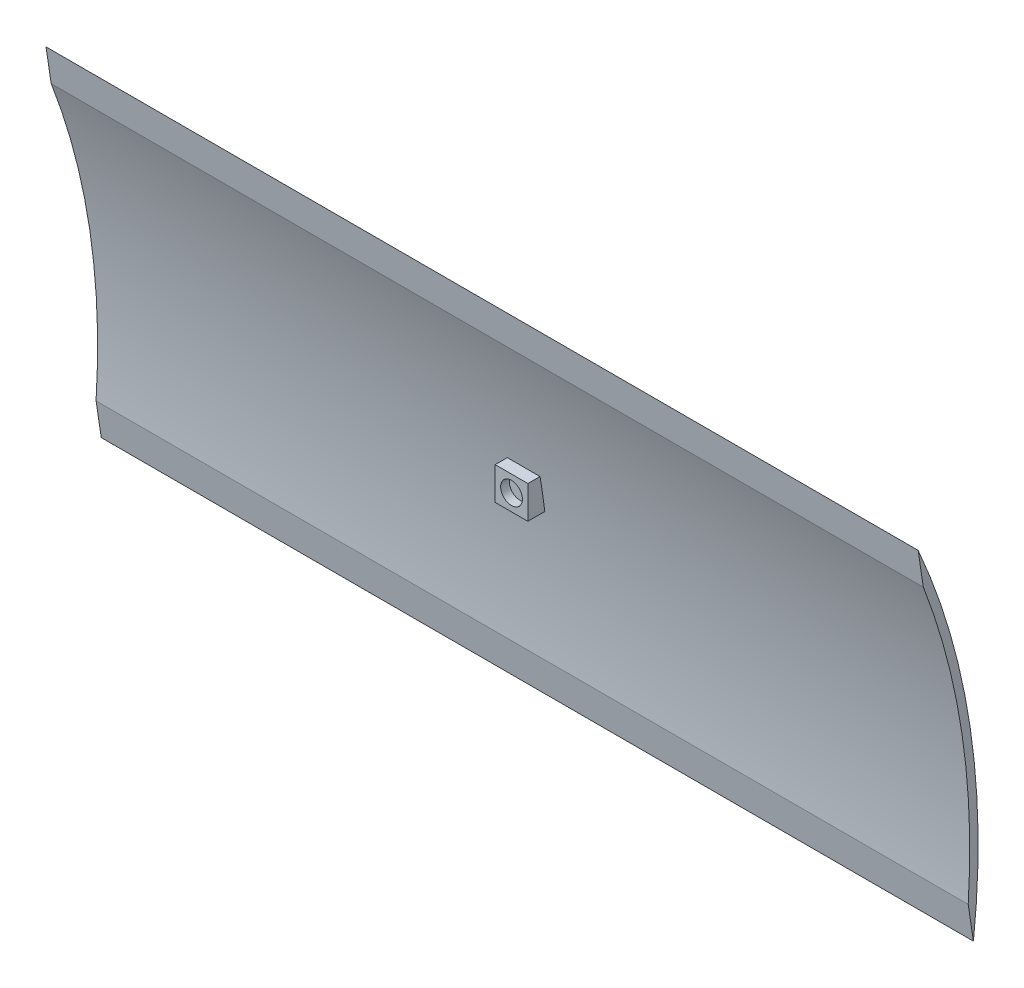
ISO-10303-21;
HEADER;
FILE_DESCRIPTION(('STEP AP214'),'2;1');
FILE_NAME('part.step','',(''),(''),'','','');
FILE_SCHEMA(('AUTOMOTIVE_DESIGN { 1 0 10303 214 1 1 1 1 }'));
ENDSEC;
DATA;
#1=APPLICATION_CONTEXT('core data for automotive mechanical design processes');
#2=APPLICATION_PROTOCOL_DEFINITION('international standard','automotive_design',2000,#1);
#3=PRODUCT_CONTEXT('',#1,'mechanical');
#4=PRODUCT('Part','Part','',(#3));
#5=PRODUCT_RELATED_PRODUCT_CATEGORY('part','',(#4));
#6=PRODUCT_DEFINITION_FORMATION('','',#4);
#7=PRODUCT_DEFINITION_CONTEXT('part definition',#1,'design');
#8=PRODUCT_DEFINITION('design','',#6,#7);
#9=PRODUCT_DEFINITION_SHAPE('','',#8);
#10=(LENGTH_UNIT() NAMED_UNIT(*) SI_UNIT(.MILLI.,.METRE.));
#11=(NAMED_UNIT(*) PLANE_ANGLE_UNIT() SI_UNIT($,.RADIAN.));
#12=(NAMED_UNIT(*) SI_UNIT($,.STERADIAN.) SOLID_ANGLE_UNIT());
#13=UNCERTAINTY_MEASURE_WITH_UNIT(LENGTH_MEASURE(1.E-05),#10,'distance_accuracy_value','');
#14=(GEOMETRIC_REPRESENTATION_CONTEXT(3) GLOBAL_UNCERTAINTY_ASSIGNED_CONTEXT((#13)) GLOBAL_UNIT_ASSIGNED_CONTEXT((#10,
#11,#12)) REPRESENTATION_CONTEXT('',''));
#15=CARTESIAN_POINT('',(0.,0.,0.));
#16=DIRECTION('',(0.,0.,1.));
#17=DIRECTION('',(1.,0.,0.));
#18=AXIS2_PLACEMENT_3D('',#15,#16,#17);
#19=CARTESIAN_POINT('',(-50.,0.,0.));
#20=DIRECTION('',(1.,0.,0.));
#21=DIRECTION('',(0.,0.,-1.));
#22=AXIS2_PLACEMENT_3D('',#19,#20,#21);
#23=CYLINDRICAL_SURFACE('',#22,160.09);
#24=CARTESIAN_POINT('',(53.75,0.,0.));
#25=DIRECTION('',(1.,0.,0.));
#26=DIRECTION('',(0.,0.,-1.));
#27=AXIS2_PLACEMENT_3D('',#24,#25,#26);
#28=CIRCLE('',#27,160.09);
#29=CARTESIAN_POINT('',(53.75,27.0890830134152,-157.781461780186));
#30=VERTEX_POINT('',#29);
#31=CARTESIAN_POINT('',(53.75,19.5890830134153,-158.886991055572));
#32=VERTEX_POINT('',#31);
#33=EDGE_CURVE('E98',#30,#32,#28,.F.);
#34=ORIENTED_EDGE('',*,*,#33,.T.);
#35=DIRECTION('',(1.,0.,0.));
#36=VECTOR('',#35,1.);
#37=CARTESIAN_POINT('',(-50.,19.5890830134152,-158.886991055572));
#38=LINE('',#37,#36);
#39=CARTESIAN_POINT('',(46.25,19.5890830134152,-158.886991055572));
#40=VERTEX_POINT('',#39);
#41=EDGE_CURVE('E101',#32,#40,#38,.F.);
#42=ORIENTED_EDGE('',*,*,#41,.T.);
#43=CARTESIAN_POINT('',(46.25,0.,0.));
#44=DIRECTION('',(-1.,0.,0.));
#45=DIRECTION('',(0.,0.,1.));
#46=AXIS2_PLACEMENT_3D('',#43,#44,#45);
#47=CIRCLE('',#46,160.09);
#48=CARTESIAN_POINT('',(46.25,27.0890830134152,-157.781461780186));
#49=VERTEX_POINT('',#48);
#50=EDGE_CURVE('E59',#40,#49,#47,.F.);
#51=ORIENTED_EDGE('',*,*,#50,.T.);
#52=DIRECTION('',(1.,0.,0.));
#53=VECTOR('',#52,1.);
#54=CARTESIAN_POINT('',(-50.,27.0890830134152,-157.781461780186));
#55=LINE('',#54,#53);
#56=EDGE_CURVE('E54',#49,#30,#55,.T.);
#57=ORIENTED_EDGE('',*,*,#56,.T.);
#58=EDGE_LOOP('',(#34,#42,#51,#57));
#59=FACE_BOUND('',#58,.T.);
#60=DIRECTION('',(1.,0.,0.));
#61=VECTOR('',#60,1.);
#62=CARTESIAN_POINT('',(-50.,-10.7314070648173,-159.72991267264));
#63=LINE('',#62,#61);
#64=CARTESIAN_POINT('',(-50.,-10.7314070648173,-159.72991267264));
#65=VERTEX_POINT('',#64);
#66=CARTESIAN_POINT('',(150.,-10.7314070648173,-159.72991267264));
#67=VERTEX_POINT('',#66);
#68=EDGE_CURVE('E41',#65,#67,#63,.T.);
#69=ORIENTED_EDGE('',*,*,#68,.T.);
#70=CARTESIAN_POINT('',(150.,0.,0.));
#71=DIRECTION('',(-1.,0.,0.));
#72=DIRECTION('',(0.,0.,-1.));
#73=AXIS2_PLACEMENT_3D('',#70,#71,#72);
#74=CIRCLE('',#73,160.09);
#75=CARTESIAN_POINT('',(150.,57.4095730916477,-149.442125980042));
#76=VERTEX_POINT('',#75);
#77=EDGE_CURVE('E131',#76,#67,#74,.T.);
#78=ORIENTED_EDGE('',*,*,#77,.F.);
#79=DIRECTION('',(1.,0.,0.));
#80=VECTOR('',#79,1.);
#81=CARTESIAN_POINT('',(-50.,57.4095730916477,-149.442125980042));
#82=LINE('',#81,#80);
#83=CARTESIAN_POINT('',(-50.,57.4095730916477,-149.442125980042));
#84=VERTEX_POINT('',#83);
#85=EDGE_CURVE('E11',#84,#76,#82,.T.);
#86=ORIENTED_EDGE('',*,*,#85,.F.);
#87=CARTESIAN_POINT('',(-50.,0.,0.));
#88=DIRECTION('',(-1.,0.,0.));
#89=DIRECTION('',(0.,0.,-1.));
#90=AXIS2_PLACEMENT_3D('',#87,#88,#89);
#91=CIRCLE('',#90,160.09);
#92=EDGE_CURVE('E143',#84,#65,#91,.T.);
#93=ORIENTED_EDGE('',*,*,#92,.T.);
#94=EDGE_LOOP('',(#69,#78,#86,#93));
#95=FACE_BOUND('',#94,.T.);
#96=ADVANCED_FACE('F38',(#59,#95),#23,.F.);
#97=CARTESIAN_POINT('',(-50.,65.3185996356515,-148.248037226931));
#98=DIRECTION('',(0.,-0.14928611469432,0.988794041223689));
#99=DIRECTION('',(0.,-0.988794041223689,-0.14928611469432));
#100=AXIS2_PLACEMENT_3D('',#97,#98,#99);
#101=PLANE('',#100);
#102=ORIENTED_EDGE('',*,*,#85,.T.);
#103=DIRECTION('',(0.,-0.988794041223689,-0.14928611469432));
#104=VECTOR('',#103,1.);
#105=CARTESIAN_POINT('',(150.,65.3185996356515,-148.248037226931));
#106=LINE('',#105,#104);
#107=CARTESIAN_POINT('',(150.,65.3185996356515,-148.248037226931));
#108=VERTEX_POINT('',#107);
#109=EDGE_CURVE('E140',#108,#76,#106,.T.);
#110=ORIENTED_EDGE('',*,*,#109,.F.);
#111=DIRECTION('',(1.,0.,0.));
#112=VECTOR('',#111,1.);
#113=CARTESIAN_POINT('',(-50.,65.3185996356515,-148.248037226931));
#114=LINE('',#113,#112);
#115=CARTESIAN_POINT('',(-50.,65.3185996356515,-148.248037226931));
#116=VERTEX_POINT('',#115);
#117=EDGE_CURVE('E46',#116,#108,#114,.T.);
#118=ORIENTED_EDGE('',*,*,#117,.F.);
#119=DIRECTION('',(0.,-0.988794041223689,-0.14928611469432));
#120=VECTOR('',#119,1.);
#121=CARTESIAN_POINT('',(-50.,65.3185996356515,-148.248037226931));
#122=LINE('',#121,#120);
#123=EDGE_CURVE('E152',#116,#84,#122,.T.);
#124=ORIENTED_EDGE('',*,*,#123,.T.);
#125=EDGE_LOOP('',(#102,#110,#118,#124));
#126=FACE_BOUND('',#125,.T.);
#127=ADVANCED_FACE('F167',(#126),#101,.T.);
#128=CARTESIAN_POINT('',(-50.,0.,0.));
#129=DIRECTION('',(1.,0.,0.));
#130=DIRECTION('',(0.,0.,-1.));
#131=AXIS2_PLACEMENT_3D('',#128,#129,#130);
#132=CYLINDRICAL_SURFACE('',#131,162.);
#133=ORIENTED_EDGE('',*,*,#117,.T.);
#134=CARTESIAN_POINT('',(150.,0.,0.));
#135=DIRECTION('',(1.,0.,0.));
#136=DIRECTION('',(0.,0.,-1.));
#137=AXIS2_PLACEMENT_3D('',#134,#135,#136);
#138=CIRCLE('',#137,162.);
#139=CARTESIAN_POINT('',(150.,-18.6404336088211,-160.924001425751));
#140=VERTEX_POINT('',#139);
#141=EDGE_CURVE('E137',#140,#108,#138,.T.);
#142=ORIENTED_EDGE('',*,*,#141,.F.);
#143=DIRECTION('',(1.,0.,0.));
#144=VECTOR('',#143,1.);
#145=CARTESIAN_POINT('',(-50.,-18.6404336088211,-160.924001425751));
#146=LINE('',#145,#144);
#147=CARTESIAN_POINT('',(-50.,-18.6404336088211,-160.924001425751));
#148=VERTEX_POINT('',#147);
#149=EDGE_CURVE('E155',#148,#140,#146,.T.);
#150=ORIENTED_EDGE('',*,*,#149,.F.);
#151=CARTESIAN_POINT('',(-50.,0.,0.));
#152=DIRECTION('',(1.,0.,0.));
#153=DIRECTION('',(0.,0.,-1.));
#154=AXIS2_PLACEMENT_3D('',#151,#152,#153);
#155=CIRCLE('',#154,162.);
#156=EDGE_CURVE('E149',#148,#116,#155,.T.);
#157=ORIENTED_EDGE('',*,*,#156,.T.);
#158=EDGE_LOOP('',(#133,#142,#150,#157));
#159=FACE_BOUND('',#158,.T.);
#160=ADVANCED_FACE('F173',(#159),#132,.T.);
#161=CARTESIAN_POINT('',(-50.,-10.7314070648173,-159.72991267264));
#162=DIRECTION('',(0.,-0.149286114694316,0.98879404122369));
#163=DIRECTION('',(0.,-0.98879404122369,-0.149286114694316));
#164=AXIS2_PLACEMENT_3D('',#161,#162,#163);
#165=PLANE('',#164);
#166=ORIENTED_EDGE('',*,*,#149,.T.);
#167=DIRECTION('',(0.,-0.98879404122369,-0.149286114694316));
#168=VECTOR('',#167,1.);
#169=CARTESIAN_POINT('',(150.,-10.7314070648173,-159.72991267264));
#170=LINE('',#169,#168);
#171=EDGE_CURVE('E134',#67,#140,#170,.T.);
#172=ORIENTED_EDGE('',*,*,#171,.F.);
#173=ORIENTED_EDGE('',*,*,#68,.F.);
#174=DIRECTION('',(0.,-0.98879404122369,-0.149286114694316));
#175=VECTOR('',#174,1.);
#176=CARTESIAN_POINT('',(-50.,-10.7314070648173,-159.72991267264));
#177=LINE('',#176,#175);
#178=EDGE_CURVE('E146',#65,#148,#177,.T.);
#179=ORIENTED_EDGE('',*,*,#178,.T.);
#180=EDGE_LOOP('',(#166,#172,#173,#179));
#181=FACE_BOUND('',#180,.T.);
#182=ADVANCED_FACE('F161',(#181),#165,.T.);
#183=CARTESIAN_POINT('',(-50.,0.,0.));
#184=DIRECTION('',(1.,0.,0.));
#185=DIRECTION('',(0.,0.,-1.));
#186=AXIS2_PLACEMENT_3D('',#183,#184,#185);
#187=PLANE('',#186);
#188=ORIENTED_EDGE('',*,*,#92,.F.);
#189=ORIENTED_EDGE('',*,*,#123,.F.);
#190=ORIENTED_EDGE('',*,*,#156,.F.);
#191=ORIENTED_EDGE('',*,*,#178,.F.);
#192=EDGE_LOOP('',(#188,#189,#190,#191));
#193=FACE_BOUND('',#192,.T.);
#194=ADVANCED_FACE('F170',(#193),#187,.F.);
#195=CARTESIAN_POINT('',(150.,0.,0.));
#196=DIRECTION('',(1.,0.,0.));
#197=DIRECTION('',(0.,0.,-1.));
#198=AXIS2_PLACEMENT_3D('',#195,#196,#197);
#199=PLANE('',#198);
#200=ORIENTED_EDGE('',*,*,#77,.T.);
#201=ORIENTED_EDGE('',*,*,#171,.T.);
#202=ORIENTED_EDGE('',*,*,#141,.T.);
#203=ORIENTED_EDGE('',*,*,#109,.T.);
#204=EDGE_LOOP('',(#200,#201,#202,#203));
#205=FACE_BOUND('',#204,.T.);
#206=ADVANCED_FACE('F164',(#205),#199,.T.);
#207=CARTESIAN_POINT('',(53.75,27.0890830134153,-162.002));
#208=DIRECTION('',(1.,0.,0.));
#209=DIRECTION('',(0.,0.,-1.));
#210=AXIS2_PLACEMENT_3D('',#207,#208,#209);
#211=PLANE('',#210);
#212=ORIENTED_EDGE('',*,*,#33,.F.);
#213=DIRECTION('',(0.,0.,1.));
#214=VECTOR('',#213,1.);
#215=CARTESIAN_POINT('',(53.75,27.0890830134153,-162.002));
#216=LINE('',#215,#214);
#217=CARTESIAN_POINT('',(53.75,27.0890830134153,-155.));
#218=VERTEX_POINT('',#217);
#219=EDGE_CURVE('E105',#30,#218,#216,.T.);
#220=ORIENTED_EDGE('',*,*,#219,.T.);
#221=DIRECTION('',(0.,1.,0.));
#222=VECTOR('',#221,1.);
#223=CARTESIAN_POINT('',(53.75,27.0890830134153,-155.));
#224=LINE('',#223,#222);
#225=CARTESIAN_POINT('',(53.75,19.5890830134153,-155.));
#226=VERTEX_POINT('',#225);
#227=EDGE_CURVE('E119',#226,#218,#224,.T.);
#228=ORIENTED_EDGE('',*,*,#227,.F.);
#229=DIRECTION('',(0.,0.,1.));
#230=VECTOR('',#229,1.);
#231=CARTESIAN_POINT('',(53.75,19.5890830134153,-162.002));
#232=LINE('',#231,#230);
#233=EDGE_CURVE('E111',#32,#226,#232,.T.);
#234=ORIENTED_EDGE('',*,*,#233,.F.);
#235=EDGE_LOOP('',(#212,#220,#228,#234));
#236=FACE_BOUND('',#235,.T.);
#237=ADVANCED_FACE('F117',(#236),#211,.T.);
#238=CARTESIAN_POINT('',(46.25,27.0890830134153,-162.002));
#239=DIRECTION('',(0.,1.,0.));
#240=DIRECTION('',(0.,0.,1.));
#241=AXIS2_PLACEMENT_3D('',#238,#239,#240);
#242=PLANE('',#241);
#243=ORIENTED_EDGE('',*,*,#56,.F.);
#244=DIRECTION('',(0.,0.,1.));
#245=VECTOR('',#244,1.);
#246=CARTESIAN_POINT('',(46.25,27.0890830134153,-162.002));
#247=LINE('',#246,#245);
#248=CARTESIAN_POINT('',(46.25,27.0890830134153,-155.));
#249=VERTEX_POINT('',#248);
#250=EDGE_CURVE('E125',#49,#249,#247,.T.);
#251=ORIENTED_EDGE('',*,*,#250,.T.);
#252=DIRECTION('',(-1.,0.,0.));
#253=VECTOR('',#252,1.);
#254=CARTESIAN_POINT('',(46.25,27.0890830134153,-155.));
#255=LINE('',#254,#253);
#256=EDGE_CURVE('E120',#218,#249,#255,.T.);
#257=ORIENTED_EDGE('',*,*,#256,.F.);
#258=ORIENTED_EDGE('',*,*,#219,.F.);
#259=EDGE_LOOP('',(#243,#251,#257,#258));
#260=FACE_BOUND('',#259,.T.);
#261=ADVANCED_FACE('F224',(#260),#242,.T.);
#262=CARTESIAN_POINT('',(46.25,27.0890830134153,-162.002));
#263=DIRECTION('',(-1.,0.,0.));
#264=DIRECTION('',(0.,0.,1.));
#265=AXIS2_PLACEMENT_3D('',#262,#263,#264);
#266=PLANE('',#265);
#267=ORIENTED_EDGE('',*,*,#50,.F.);
#268=DIRECTION('',(0.,0.,1.));
#269=VECTOR('',#268,1.);
#270=CARTESIAN_POINT('',(46.25,19.5890830134153,-162.002));
#271=LINE('',#270,#269);
#272=CARTESIAN_POINT('',(46.25,19.5890830134153,-155.));
#273=VERTEX_POINT('',#272);
#274=EDGE_CURVE('E113',#40,#273,#271,.T.);
#275=ORIENTED_EDGE('',*,*,#274,.T.);
#276=DIRECTION('',(0.,-1.,0.));
#277=VECTOR('',#276,1.);
#278=CARTESIAN_POINT('',(46.25,27.0890830134153,-155.));
#279=LINE('',#278,#277);
#280=EDGE_CURVE('E123',#249,#273,#279,.T.);
#281=ORIENTED_EDGE('',*,*,#280,.F.);
#282=ORIENTED_EDGE('',*,*,#250,.F.);
#283=EDGE_LOOP('',(#267,#275,#281,#282));
#284=FACE_BOUND('',#283,.T.);
#285=ADVANCED_FACE('F231',(#284),#266,.T.);
#286=CARTESIAN_POINT('',(46.25,19.5890830134153,-162.002));
#287=DIRECTION('',(0.,-1.,0.));
#288=DIRECTION('',(0.,0.,-1.));
#289=AXIS2_PLACEMENT_3D('',#286,#287,#288);
#290=PLANE('',#289);
#291=ORIENTED_EDGE('',*,*,#41,.F.);
#292=ORIENTED_EDGE('',*,*,#233,.T.);
#293=DIRECTION('',(1.,0.,0.));
#294=VECTOR('',#293,1.);
#295=CARTESIAN_POINT('',(46.25,19.5890830134153,-155.));
#296=LINE('',#295,#294);
#297=EDGE_CURVE('E291',#273,#226,#296,.T.);
#298=ORIENTED_EDGE('',*,*,#297,.F.);
#299=ORIENTED_EDGE('',*,*,#274,.F.);
#300=EDGE_LOOP('',(#291,#292,#298,#299));
#301=FACE_BOUND('',#300,.T.);
#302=ADVANCED_FACE('F109',(#301),#290,.T.);
#303=CARTESIAN_POINT('',(0.,0.,-155.));
#304=DIRECTION('',(0.,0.,1.));
#305=DIRECTION('',(1.,0.,0.));
#306=AXIS2_PLACEMENT_3D('',#303,#304,#305);
#307=PLANE('',#306);
#308=CARTESIAN_POINT('',(50.,23.3390830134153,-155.));
#309=DIRECTION('',(0.,0.,1.));
#310=DIRECTION('',(1.,0.,0.));
#311=AXIS2_PLACEMENT_3D('',#308,#309,#310);
#312=CIRCLE('',#311,2.49999999999999);
#313=CARTESIAN_POINT('',(52.5,23.3390830134153,-155.));
#314=VERTEX_POINT('',#313);
#315=EDGE_CURVE('E286',#314,#314,#312,.T.);
#316=ORIENTED_EDGE('',*,*,#315,.F.);
#317=EDGE_LOOP('',(#316));
#318=FACE_BOUND('',#317,.T.);
#319=ORIENTED_EDGE('',*,*,#227,.T.);
#320=ORIENTED_EDGE('',*,*,#256,.T.);
#321=ORIENTED_EDGE('',*,*,#280,.T.);
#322=ORIENTED_EDGE('',*,*,#297,.T.);
#323=EDGE_LOOP('',(#319,#320,#321,#322));
#324=FACE_BOUND('',#323,.T.);
#325=ADVANCED_FACE('F216',(#318,#324),#307,.T.);
#326=CARTESIAN_POINT('',(50.,23.3390830134153,-157.));
#327=DIRECTION('',(0.,0.,1.));
#328=DIRECTION('',(1.,0.,0.));
#329=AXIS2_PLACEMENT_3D('',#326,#327,#328);
#330=CYLINDRICAL_SURFACE('',#329,2.49999999999999);
#331=CARTESIAN_POINT('',(50.,23.3390830134153,-157.));
#332=DIRECTION('',(0.,0.,1.));
#333=DIRECTION('',(1.,0.,0.));
#334=AXIS2_PLACEMENT_3D('',#331,#332,#333);
#335=CIRCLE('',#334,2.49999999999999);
#336=CARTESIAN_POINT('',(52.5,23.3390830134153,-157.));
#337=VERTEX_POINT('',#336);
#338=EDGE_CURVE('E114',#337,#337,#335,.T.);
#339=ORIENTED_EDGE('',*,*,#338,.F.);
#340=EDGE_LOOP('',(#339));
#341=FACE_BOUND('',#340,.T.);
#342=ORIENTED_EDGE('',*,*,#315,.T.);
#343=EDGE_LOOP('',(#342));
#344=FACE_BOUND('',#343,.T.);
#345=ADVANCED_FACE('F226',(#341,#344),#330,.F.);
#346=CARTESIAN_POINT('',(50.,23.3390830134153,-157.));
#347=DIRECTION('',(0.,0.,1.));
#348=DIRECTION('',(1.,0.,0.));
#349=AXIS2_PLACEMENT_3D('',#346,#347,#348);
#350=PLANE('',#349);
#351=ORIENTED_EDGE('',*,*,#338,.T.);
#352=EDGE_LOOP('',(#351));
#353=FACE_BOUND('',#352,.T.);
#354=ADVANCED_FACE('F259',(#353),#350,.T.);
#355=CLOSED_SHELL('',(#96,#127,#160,#182,#194,#206,#237,#261,#285,#302,#325,#345,#354));
#356=MANIFOLD_SOLID_BREP('B2',#355);
#357=ADVANCED_BREP_SHAPE_REPRESENTATION('',(#18,#356),#14);
#358=SHAPE_DEFINITION_REPRESENTATION(#9,#357);
ENDSEC;
END-ISO-10303-21;
